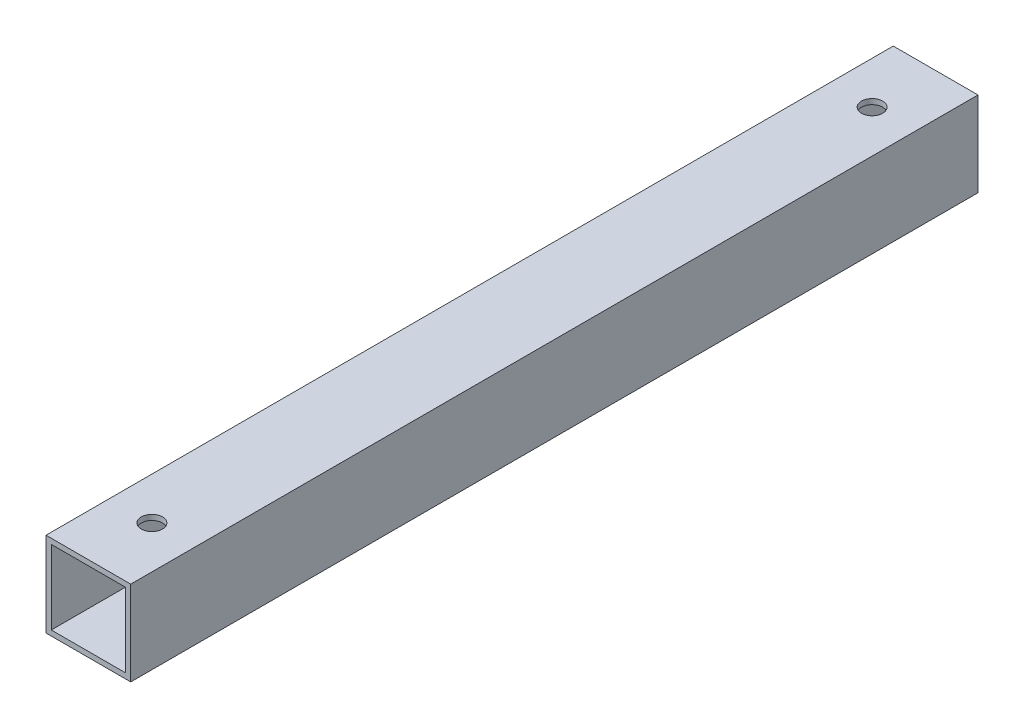
ISO-10303-21;
HEADER;
FILE_DESCRIPTION(('STEP AP214'),'2;1');
FILE_NAME('part.step','',(''),(''),'','','');
FILE_SCHEMA(('AUTOMOTIVE_DESIGN { 1 0 10303 214 1 1 1 1 }'));
ENDSEC;
DATA;
#1=APPLICATION_CONTEXT('core data for automotive mechanical design processes');
#2=APPLICATION_PROTOCOL_DEFINITION('international standard','automotive_design',2000,#1);
#3=PRODUCT_CONTEXT('',#1,'mechanical');
#4=PRODUCT('Part','Part','',(#3));
#5=PRODUCT_RELATED_PRODUCT_CATEGORY('part','',(#4));
#6=PRODUCT_DEFINITION_FORMATION('','',#4);
#7=PRODUCT_DEFINITION_CONTEXT('part definition',#1,'design');
#8=PRODUCT_DEFINITION('design','',#6,#7);
#9=PRODUCT_DEFINITION_SHAPE('','',#8);
#10=(LENGTH_UNIT() NAMED_UNIT(*) SI_UNIT(.MILLI.,.METRE.));
#11=(NAMED_UNIT(*) PLANE_ANGLE_UNIT() SI_UNIT($,.RADIAN.));
#12=(NAMED_UNIT(*) SI_UNIT($,.STERADIAN.) SOLID_ANGLE_UNIT());
#13=UNCERTAINTY_MEASURE_WITH_UNIT(LENGTH_MEASURE(1.E-05),#10,'distance_accuracy_value','');
#14=(GEOMETRIC_REPRESENTATION_CONTEXT(3) GLOBAL_UNCERTAINTY_ASSIGNED_CONTEXT((#13)) GLOBAL_UNIT_ASSIGNED_CONTEXT((#10,
#11,#12)) REPRESENTATION_CONTEXT('',''));
#15=CARTESIAN_POINT('',(0.,0.,0.));
#16=DIRECTION('',(0.,0.,1.));
#17=DIRECTION('',(1.,0.,0.));
#18=AXIS2_PLACEMENT_3D('',#15,#16,#17);
#19=CARTESIAN_POINT('',(0.,0.,254.));
#20=DIRECTION('',(0.,0.,-1.));
#21=DIRECTION('',(-1.,0.,0.));
#22=AXIS2_PLACEMENT_3D('',#19,#20,#21);
#23=PLANE('',#22);
#24=DIRECTION('',(0.,1.,0.));
#25=VECTOR('',#24,1.);
#26=CARTESIAN_POINT('',(12.7,-12.7,254.));
#27=LINE('',#26,#25);
#28=CARTESIAN_POINT('',(12.7,-12.7,254.));
#29=VERTEX_POINT('',#28);
#30=CARTESIAN_POINT('',(12.7,12.7,254.));
#31=VERTEX_POINT('',#30);
#32=EDGE_CURVE('E137',#29,#31,#27,.T.);
#33=ORIENTED_EDGE('',*,*,#32,.T.);
#34=DIRECTION('',(-1.,0.,0.));
#35=VECTOR('',#34,1.);
#36=CARTESIAN_POINT('',(-12.7,12.7,254.));
#37=LINE('',#36,#35);
#38=CARTESIAN_POINT('',(-12.7,12.7,254.));
#39=VERTEX_POINT('',#38);
#40=EDGE_CURVE('E140',#31,#39,#37,.T.);
#41=ORIENTED_EDGE('',*,*,#40,.T.);
#42=DIRECTION('',(0.,-1.,0.));
#43=VECTOR('',#42,1.);
#44=CARTESIAN_POINT('',(-12.7,-12.7,254.));
#45=LINE('',#44,#43);
#46=CARTESIAN_POINT('',(-12.7,-12.7,254.));
#47=VERTEX_POINT('',#46);
#48=EDGE_CURVE('E143',#39,#47,#45,.T.);
#49=ORIENTED_EDGE('',*,*,#48,.T.);
#50=DIRECTION('',(1.,0.,0.));
#51=VECTOR('',#50,1.);
#52=CARTESIAN_POINT('',(-12.7,-12.7,254.));
#53=LINE('',#52,#51);
#54=EDGE_CURVE('E145',#47,#29,#53,.T.);
#55=ORIENTED_EDGE('',*,*,#54,.T.);
#56=EDGE_LOOP('',(#33,#41,#49,#55));
#57=FACE_BOUND('',#56,.T.);
#58=DIRECTION('',(0.,1.,0.));
#59=VECTOR('',#58,1.);
#60=CARTESIAN_POINT('',(11.1125,-11.1125,254.));
#61=LINE('',#60,#59);
#62=CARTESIAN_POINT('',(11.1125,-11.1125,254.));
#63=VERTEX_POINT('',#62);
#64=CARTESIAN_POINT('',(11.1125,11.1125,254.));
#65=VERTEX_POINT('',#64);
#66=EDGE_CURVE('E99',#63,#65,#61,.T.);
#67=ORIENTED_EDGE('',*,*,#66,.F.);
#68=DIRECTION('',(1.,0.,0.));
#69=VECTOR('',#68,1.);
#70=CARTESIAN_POINT('',(-11.1125,-11.1125,254.));
#71=LINE('',#70,#69);
#72=CARTESIAN_POINT('',(-11.1125,-11.1125,254.));
#73=VERTEX_POINT('',#72);
#74=EDGE_CURVE('E121',#73,#63,#71,.T.);
#75=ORIENTED_EDGE('',*,*,#74,.F.);
#76=DIRECTION('',(0.,-1.,0.));
#77=VECTOR('',#76,1.);
#78=CARTESIAN_POINT('',(-11.1125,-11.1125,254.));
#79=LINE('',#78,#77);
#80=CARTESIAN_POINT('',(-11.1125,11.1125,254.));
#81=VERTEX_POINT('',#80);
#82=EDGE_CURVE('E119',#81,#73,#79,.T.);
#83=ORIENTED_EDGE('',*,*,#82,.F.);
#84=DIRECTION('',(-1.,0.,0.));
#85=VECTOR('',#84,1.);
#86=CARTESIAN_POINT('',(-11.1125,11.1125,254.));
#87=LINE('',#86,#85);
#88=EDGE_CURVE('E107',#65,#81,#87,.T.);
#89=ORIENTED_EDGE('',*,*,#88,.F.);
#90=EDGE_LOOP('',(#67,#75,#83,#89));
#91=FACE_BOUND('',#90,.T.);
#92=ADVANCED_FACE('F32',(#57,#91),#23,.F.);
#93=CARTESIAN_POINT('',(0.,0.,0.));
#94=DIRECTION('',(0.,0.,-1.));
#95=DIRECTION('',(-1.,0.,0.));
#96=AXIS2_PLACEMENT_3D('',#93,#94,#95);
#97=PLANE('',#96);
#98=DIRECTION('',(0.,1.,0.));
#99=VECTOR('',#98,1.);
#100=CARTESIAN_POINT('',(12.7,-12.7,0.));
#101=LINE('',#100,#99);
#102=CARTESIAN_POINT('',(12.7,-12.7,0.));
#103=VERTEX_POINT('',#102);
#104=CARTESIAN_POINT('',(12.7,12.7,0.));
#105=VERTEX_POINT('',#104);
#106=EDGE_CURVE('E115',#103,#105,#101,.T.);
#107=ORIENTED_EDGE('',*,*,#106,.F.);
#108=DIRECTION('',(1.,0.,0.));
#109=VECTOR('',#108,1.);
#110=CARTESIAN_POINT('',(-12.7,-12.7,0.));
#111=LINE('',#110,#109);
#112=CARTESIAN_POINT('',(-12.7,-12.7,0.));
#113=VERTEX_POINT('',#112);
#114=EDGE_CURVE('E141',#113,#103,#111,.T.);
#115=ORIENTED_EDGE('',*,*,#114,.F.);
#116=DIRECTION('',(0.,-1.,0.));
#117=VECTOR('',#116,1.);
#118=CARTESIAN_POINT('',(-12.7,-12.7,0.));
#119=LINE('',#118,#117);
#120=CARTESIAN_POINT('',(-12.7,12.7,0.));
#121=VERTEX_POINT('',#120);
#122=EDGE_CURVE('E152',#121,#113,#119,.T.);
#123=ORIENTED_EDGE('',*,*,#122,.F.);
#124=DIRECTION('',(-1.,0.,0.));
#125=VECTOR('',#124,1.);
#126=CARTESIAN_POINT('',(-12.7,12.7,0.));
#127=LINE('',#126,#125);
#128=EDGE_CURVE('E150',#105,#121,#127,.T.);
#129=ORIENTED_EDGE('',*,*,#128,.F.);
#130=EDGE_LOOP('',(#107,#115,#123,#129));
#131=FACE_BOUND('',#130,.T.);
#132=DIRECTION('',(1.,0.,0.));
#133=VECTOR('',#132,1.);
#134=CARTESIAN_POINT('',(-11.1125,-11.1125,0.));
#135=LINE('',#134,#133);
#136=CARTESIAN_POINT('',(-11.1125,-11.1125,0.));
#137=VERTEX_POINT('',#136);
#138=CARTESIAN_POINT('',(11.1125,-11.1125,0.));
#139=VERTEX_POINT('',#138);
#140=EDGE_CURVE('E108',#137,#139,#135,.T.);
#141=ORIENTED_EDGE('',*,*,#140,.T.);
#142=DIRECTION('',(0.,1.,0.));
#143=VECTOR('',#142,1.);
#144=CARTESIAN_POINT('',(11.1125,-11.1125,0.));
#145=LINE('',#144,#143);
#146=CARTESIAN_POINT('',(11.1125,11.1125,0.));
#147=VERTEX_POINT('',#146);
#148=EDGE_CURVE('E57',#139,#147,#145,.T.);
#149=ORIENTED_EDGE('',*,*,#148,.T.);
#150=DIRECTION('',(-1.,0.,0.));
#151=VECTOR('',#150,1.);
#152=CARTESIAN_POINT('',(-11.1125,11.1125,0.));
#153=LINE('',#152,#151);
#154=CARTESIAN_POINT('',(-11.1125,11.1125,0.));
#155=VERTEX_POINT('',#154);
#156=EDGE_CURVE('E114',#147,#155,#153,.T.);
#157=ORIENTED_EDGE('',*,*,#156,.T.);
#158=DIRECTION('',(0.,-1.,0.));
#159=VECTOR('',#158,1.);
#160=CARTESIAN_POINT('',(-11.1125,-11.1125,0.));
#161=LINE('',#160,#159);
#162=EDGE_CURVE('E129',#155,#137,#161,.T.);
#163=ORIENTED_EDGE('',*,*,#162,.T.);
#164=EDGE_LOOP('',(#141,#149,#157,#163));
#165=FACE_BOUND('',#164,.T.);
#166=ADVANCED_FACE('F199',(#131,#165),#97,.T.);
#167=CARTESIAN_POINT('',(12.7,-12.7,254.));
#168=DIRECTION('',(-1.,0.,0.));
#169=DIRECTION('',(0.,0.,1.));
#170=AXIS2_PLACEMENT_3D('',#167,#168,#169);
#171=PLANE('',#170);
#172=ORIENTED_EDGE('',*,*,#106,.T.);
#173=DIRECTION('',(0.,0.,-1.));
#174=VECTOR('',#173,1.);
#175=CARTESIAN_POINT('',(12.7,12.7,254.));
#176=LINE('',#175,#174);
#177=EDGE_CURVE('E11',#31,#105,#176,.T.);
#178=ORIENTED_EDGE('',*,*,#177,.F.);
#179=ORIENTED_EDGE('',*,*,#32,.F.);
#180=DIRECTION('',(0.,0.,-1.));
#181=VECTOR('',#180,1.);
#182=CARTESIAN_POINT('',(12.7,-12.7,254.));
#183=LINE('',#182,#181);
#184=EDGE_CURVE('E147',#29,#103,#183,.T.);
#185=ORIENTED_EDGE('',*,*,#184,.T.);
#186=EDGE_LOOP('',(#172,#178,#179,#185));
#187=FACE_BOUND('',#186,.T.);
#188=ADVANCED_FACE('F34',(#187),#171,.F.);
#189=CARTESIAN_POINT('',(-12.7,12.7,254.));
#190=DIRECTION('',(0.,-1.,0.));
#191=DIRECTION('',(0.,0.,-1.));
#192=AXIS2_PLACEMENT_3D('',#189,#190,#191);
#193=PLANE('',#192);
#194=CARTESIAN_POINT('',(0.,12.7,234.95));
#195=DIRECTION('',(0.,1.,0.));
#196=DIRECTION('',(0.,0.,1.));
#197=AXIS2_PLACEMENT_3D('',#194,#195,#196);
#198=CIRCLE('',#197,3.175);
#199=CARTESIAN_POINT('',(0.,12.7,238.125));
#200=VERTEX_POINT('',#199);
#201=EDGE_CURVE('E178',#200,#200,#198,.T.);
#202=ORIENTED_EDGE('',*,*,#201,.F.);
#203=EDGE_LOOP('',(#202));
#204=FACE_BOUND('',#203,.T.);
#205=CARTESIAN_POINT('',(0.,12.7,19.05));
#206=DIRECTION('',(0.,1.,0.));
#207=DIRECTION('',(0.,0.,1.));
#208=AXIS2_PLACEMENT_3D('',#205,#206,#207);
#209=CIRCLE('',#208,3.175);
#210=CARTESIAN_POINT('',(0.,12.7,22.225));
#211=VERTEX_POINT('',#210);
#212=EDGE_CURVE('E168',#211,#211,#209,.T.);
#213=ORIENTED_EDGE('',*,*,#212,.F.);
#214=EDGE_LOOP('',(#213));
#215=FACE_BOUND('',#214,.T.);
#216=ORIENTED_EDGE('',*,*,#128,.T.);
#217=DIRECTION('',(0.,0.,-1.));
#218=VECTOR('',#217,1.);
#219=CARTESIAN_POINT('',(-12.7,12.7,254.));
#220=LINE('',#219,#218);
#221=EDGE_CURVE('E41',#39,#121,#220,.T.);
#222=ORIENTED_EDGE('',*,*,#221,.F.);
#223=ORIENTED_EDGE('',*,*,#40,.F.);
#224=ORIENTED_EDGE('',*,*,#177,.T.);
#225=EDGE_LOOP('',(#216,#222,#223,#224));
#226=FACE_BOUND('',#225,.T.);
#227=ADVANCED_FACE('F223',(#204,#215,#226),#193,.F.);
#228=CARTESIAN_POINT('',(-12.7,-12.7,254.));
#229=DIRECTION('',(1.,0.,0.));
#230=DIRECTION('',(0.,0.,-1.));
#231=AXIS2_PLACEMENT_3D('',#228,#229,#230);
#232=PLANE('',#231);
#233=ORIENTED_EDGE('',*,*,#122,.T.);
#234=DIRECTION('',(0.,0.,-1.));
#235=VECTOR('',#234,1.);
#236=CARTESIAN_POINT('',(-12.7,-12.7,254.));
#237=LINE('',#236,#235);
#238=EDGE_CURVE('E157',#47,#113,#237,.T.);
#239=ORIENTED_EDGE('',*,*,#238,.F.);
#240=ORIENTED_EDGE('',*,*,#48,.F.);
#241=ORIENTED_EDGE('',*,*,#221,.T.);
#242=EDGE_LOOP('',(#233,#239,#240,#241));
#243=FACE_BOUND('',#242,.T.);
#244=ADVANCED_FACE('F221',(#243),#232,.F.);
#245=CARTESIAN_POINT('',(-12.7,-12.7,254.));
#246=DIRECTION('',(0.,1.,0.));
#247=DIRECTION('',(0.,0.,1.));
#248=AXIS2_PLACEMENT_3D('',#245,#246,#247);
#249=PLANE('',#248);
#250=CARTESIAN_POINT('',(0.,-12.7,234.95));
#251=DIRECTION('',(0.,1.,0.));
#252=DIRECTION('',(0.,0.,1.));
#253=AXIS2_PLACEMENT_3D('',#250,#251,#252);
#254=CIRCLE('',#253,3.175);
#255=CARTESIAN_POINT('',(0.,-12.7,238.125));
#256=VERTEX_POINT('',#255);
#257=EDGE_CURVE('E181',#256,#256,#254,.T.);
#258=ORIENTED_EDGE('',*,*,#257,.T.);
#259=EDGE_LOOP('',(#258));
#260=FACE_BOUND('',#259,.T.);
#261=CARTESIAN_POINT('',(0.,-12.7,19.05));
#262=DIRECTION('',(0.,1.,0.));
#263=DIRECTION('',(0.,0.,1.));
#264=AXIS2_PLACEMENT_3D('',#261,#262,#263);
#265=CIRCLE('',#264,3.175);
#266=CARTESIAN_POINT('',(0.,-12.7,22.225));
#267=VERTEX_POINT('',#266);
#268=EDGE_CURVE('E163',#267,#267,#265,.T.);
#269=ORIENTED_EDGE('',*,*,#268,.T.);
#270=EDGE_LOOP('',(#269));
#271=FACE_BOUND('',#270,.T.);
#272=ORIENTED_EDGE('',*,*,#114,.T.);
#273=ORIENTED_EDGE('',*,*,#184,.F.);
#274=ORIENTED_EDGE('',*,*,#54,.F.);
#275=ORIENTED_EDGE('',*,*,#238,.T.);
#276=EDGE_LOOP('',(#272,#273,#274,#275));
#277=FACE_BOUND('',#276,.T.);
#278=ADVANCED_FACE('F218',(#260,#271,#277),#249,.F.);
#279=CARTESIAN_POINT('',(11.1125,-11.1125,254.));
#280=DIRECTION('',(-1.,0.,0.));
#281=DIRECTION('',(0.,0.,1.));
#282=AXIS2_PLACEMENT_3D('',#279,#280,#281);
#283=PLANE('',#282);
#284=ORIENTED_EDGE('',*,*,#148,.F.);
#285=DIRECTION('',(0.,0.,-1.));
#286=VECTOR('',#285,1.);
#287=CARTESIAN_POINT('',(11.1125,-11.1125,254.));
#288=LINE('',#287,#286);
#289=EDGE_CURVE('E103',#63,#139,#288,.T.);
#290=ORIENTED_EDGE('',*,*,#289,.F.);
#291=ORIENTED_EDGE('',*,*,#66,.T.);
#292=DIRECTION('',(0.,0.,-1.));
#293=VECTOR('',#292,1.);
#294=CARTESIAN_POINT('',(11.1125,11.1125,254.));
#295=LINE('',#294,#293);
#296=EDGE_CURVE('E102',#65,#147,#295,.T.);
#297=ORIENTED_EDGE('',*,*,#296,.T.);
#298=EDGE_LOOP('',(#284,#290,#291,#297));
#299=FACE_BOUND('',#298,.T.);
#300=ADVANCED_FACE('F101',(#299),#283,.T.);
#301=CARTESIAN_POINT('',(-11.1125,11.1125,254.));
#302=DIRECTION('',(0.,-1.,0.));
#303=DIRECTION('',(0.,0.,-1.));
#304=AXIS2_PLACEMENT_3D('',#301,#302,#303);
#305=PLANE('',#304);
#306=CARTESIAN_POINT('',(0.,11.1125,234.95));
#307=DIRECTION('',(0.,-1.,0.));
#308=DIRECTION('',(0.,0.,-1.));
#309=AXIS2_PLACEMENT_3D('',#306,#307,#308);
#310=CIRCLE('',#309,3.175);
#311=CARTESIAN_POINT('',(0.,11.1125,231.775));
#312=VERTEX_POINT('',#311);
#313=EDGE_CURVE('E173',#312,#312,#310,.T.);
#314=ORIENTED_EDGE('',*,*,#313,.F.);
#315=EDGE_LOOP('',(#314));
#316=FACE_BOUND('',#315,.T.);
#317=CARTESIAN_POINT('',(0.,11.1125,19.05));
#318=DIRECTION('',(0.,-1.,0.));
#319=DIRECTION('',(0.,0.,-1.));
#320=AXIS2_PLACEMENT_3D('',#317,#318,#319);
#321=CIRCLE('',#320,3.175);
#322=CARTESIAN_POINT('',(0.,11.1125,15.875));
#323=VERTEX_POINT('',#322);
#324=EDGE_CURVE('E127',#323,#323,#321,.T.);
#325=ORIENTED_EDGE('',*,*,#324,.F.);
#326=EDGE_LOOP('',(#325));
#327=FACE_BOUND('',#326,.T.);
#328=ORIENTED_EDGE('',*,*,#156,.F.);
#329=ORIENTED_EDGE('',*,*,#296,.F.);
#330=ORIENTED_EDGE('',*,*,#88,.T.);
#331=DIRECTION('',(0.,0.,-1.));
#332=VECTOR('',#331,1.);
#333=CARTESIAN_POINT('',(-11.1125,11.1125,254.));
#334=LINE('',#333,#332);
#335=EDGE_CURVE('E116',#81,#155,#334,.T.);
#336=ORIENTED_EDGE('',*,*,#335,.T.);
#337=EDGE_LOOP('',(#328,#329,#330,#336));
#338=FACE_BOUND('',#337,.T.);
#339=ADVANCED_FACE('F111',(#316,#327,#338),#305,.T.);
#340=CARTESIAN_POINT('',(-11.1125,-11.1125,254.));
#341=DIRECTION('',(1.,0.,0.));
#342=DIRECTION('',(0.,0.,-1.));
#343=AXIS2_PLACEMENT_3D('',#340,#341,#342);
#344=PLANE('',#343);
#345=ORIENTED_EDGE('',*,*,#162,.F.);
#346=ORIENTED_EDGE('',*,*,#335,.F.);
#347=ORIENTED_EDGE('',*,*,#82,.T.);
#348=DIRECTION('',(0.,0.,-1.));
#349=VECTOR('',#348,1.);
#350=CARTESIAN_POINT('',(-11.1125,-11.1125,254.));
#351=LINE('',#350,#349);
#352=EDGE_CURVE('E49',#73,#137,#351,.T.);
#353=ORIENTED_EDGE('',*,*,#352,.T.);
#354=EDGE_LOOP('',(#345,#346,#347,#353));
#355=FACE_BOUND('',#354,.T.);
#356=ADVANCED_FACE('F195',(#355),#344,.T.);
#357=CARTESIAN_POINT('',(-11.1125,-11.1125,254.));
#358=DIRECTION('',(0.,1.,0.));
#359=DIRECTION('',(0.,0.,1.));
#360=AXIS2_PLACEMENT_3D('',#357,#358,#359);
#361=PLANE('',#360);
#362=CARTESIAN_POINT('',(0.,-11.1125,234.95));
#363=DIRECTION('',(0.,1.,0.));
#364=DIRECTION('',(0.,0.,1.));
#365=AXIS2_PLACEMENT_3D('',#362,#363,#364);
#366=CIRCLE('',#365,3.175);
#367=CARTESIAN_POINT('',(0.,-11.1125,238.125));
#368=VERTEX_POINT('',#367);
#369=EDGE_CURVE('E36',#368,#368,#366,.T.);
#370=ORIENTED_EDGE('',*,*,#369,.F.);
#371=EDGE_LOOP('',(#370));
#372=FACE_BOUND('',#371,.T.);
#373=CARTESIAN_POINT('',(0.,-11.1125,19.05));
#374=DIRECTION('',(0.,1.,0.));
#375=DIRECTION('',(0.,0.,1.));
#376=AXIS2_PLACEMENT_3D('',#373,#374,#375);
#377=CIRCLE('',#376,3.175);
#378=CARTESIAN_POINT('',(0.,-11.1125,22.225));
#379=VERTEX_POINT('',#378);
#380=EDGE_CURVE('E161',#379,#379,#377,.T.);
#381=ORIENTED_EDGE('',*,*,#380,.F.);
#382=EDGE_LOOP('',(#381));
#383=FACE_BOUND('',#382,.T.);
#384=ORIENTED_EDGE('',*,*,#140,.F.);
#385=ORIENTED_EDGE('',*,*,#352,.F.);
#386=ORIENTED_EDGE('',*,*,#74,.T.);
#387=ORIENTED_EDGE('',*,*,#289,.T.);
#388=EDGE_LOOP('',(#384,#385,#386,#387));
#389=FACE_BOUND('',#388,.T.);
#390=ADVANCED_FACE('F191',(#372,#383,#389),#361,.T.);
#391=CARTESIAN_POINT('',(0.,-12.7,19.05));
#392=DIRECTION('',(0.,1.,0.));
#393=DIRECTION('',(0.,0.,1.));
#394=AXIS2_PLACEMENT_3D('',#391,#392,#393);
#395=CYLINDRICAL_SURFACE('',#394,3.175);
#396=ORIENTED_EDGE('',*,*,#380,.T.);
#397=EDGE_LOOP('',(#396));
#398=FACE_BOUND('',#397,.T.);
#399=ORIENTED_EDGE('',*,*,#268,.F.);
#400=EDGE_LOOP('',(#399));
#401=FACE_BOUND('',#400,.T.);
#402=ADVANCED_FACE('F194',(#398,#401),#395,.F.);
#403=ORIENTED_EDGE('',*,*,#324,.T.);
#404=EDGE_LOOP('',(#403));
#405=FACE_BOUND('',#404,.T.);
#406=ORIENTED_EDGE('',*,*,#212,.T.);
#407=EDGE_LOOP('',(#406));
#408=FACE_BOUND('',#407,.T.);
#409=ADVANCED_FACE('F247',(#405,#408),#395,.F.);
#410=CARTESIAN_POINT('',(0.,-12.7,234.95));
#411=DIRECTION('',(0.,1.,0.));
#412=DIRECTION('',(0.,0.,1.));
#413=AXIS2_PLACEMENT_3D('',#410,#411,#412);
#414=CYLINDRICAL_SURFACE('',#413,3.175);
#415=ORIENTED_EDGE('',*,*,#369,.T.);
#416=EDGE_LOOP('',(#415));
#417=FACE_BOUND('',#416,.T.);
#418=ORIENTED_EDGE('',*,*,#257,.F.);
#419=EDGE_LOOP('',(#418));
#420=FACE_BOUND('',#419,.T.);
#421=ADVANCED_FACE('F188',(#417,#420),#414,.F.);
#422=ORIENTED_EDGE('',*,*,#313,.T.);
#423=EDGE_LOOP('',(#422));
#424=FACE_BOUND('',#423,.T.);
#425=ORIENTED_EDGE('',*,*,#201,.T.);
#426=EDGE_LOOP('',(#425));
#427=FACE_BOUND('',#426,.T.);
#428=ADVANCED_FACE('F255',(#424,#427),#414,.F.);
#429=CLOSED_SHELL('',(#92,#166,#188,#227,#244,#278,#300,#339,#356,#390,#402,#409,#421,#428));
#430=MANIFOLD_SOLID_BREP('B2',#429);
#431=ADVANCED_BREP_SHAPE_REPRESENTATION('',(#18,#430),#14);
#432=SHAPE_DEFINITION_REPRESENTATION(#9,#431);
ENDSEC;
END-ISO-10303-21;
